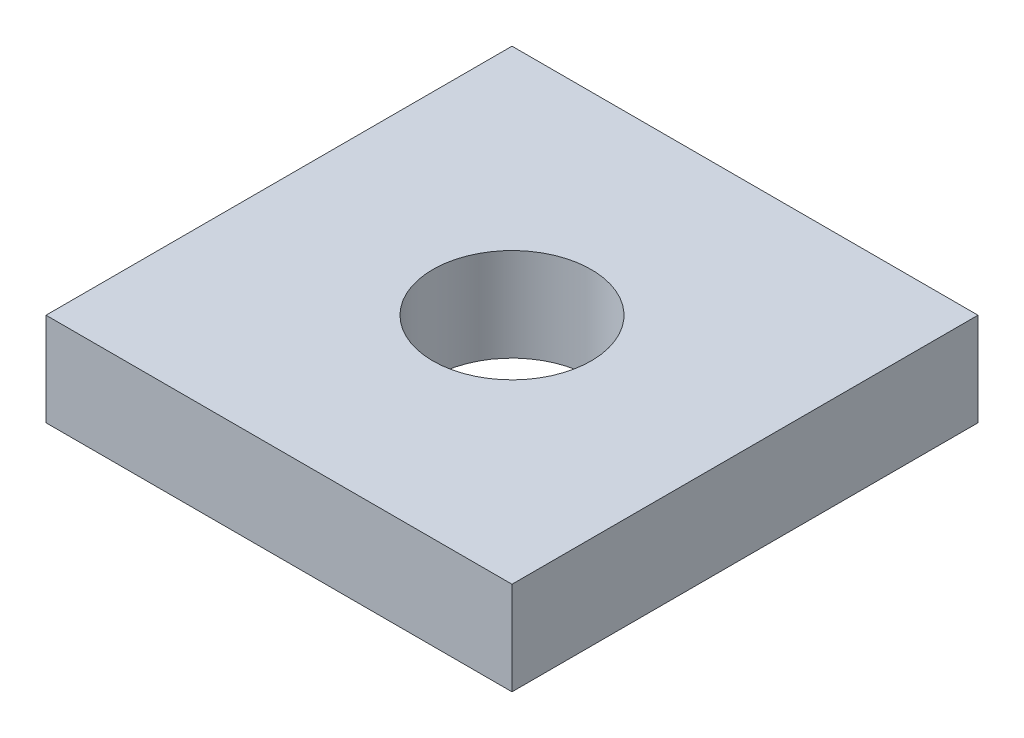
ISO-10303-21;
HEADER;
FILE_DESCRIPTION(('STEP AP214'),'2;1');
FILE_NAME('part.step','',(''),(''),'','','');
FILE_SCHEMA(('AUTOMOTIVE_DESIGN { 1 0 10303 214 1 1 1 1 }'));
ENDSEC;
DATA;
#1=APPLICATION_CONTEXT('core data for automotive mechanical design processes');
#2=APPLICATION_PROTOCOL_DEFINITION('international standard','automotive_design',2000,#1);
#3=PRODUCT_CONTEXT('',#1,'mechanical');
#4=PRODUCT('Part','Part','',(#3));
#5=PRODUCT_RELATED_PRODUCT_CATEGORY('part','',(#4));
#6=PRODUCT_DEFINITION_FORMATION('','',#4);
#7=PRODUCT_DEFINITION_CONTEXT('part definition',#1,'design');
#8=PRODUCT_DEFINITION('design','',#6,#7);
#9=PRODUCT_DEFINITION_SHAPE('','',#8);
#10=(LENGTH_UNIT() NAMED_UNIT(*) SI_UNIT(.MILLI.,.METRE.));
#11=(NAMED_UNIT(*) PLANE_ANGLE_UNIT() SI_UNIT($,.RADIAN.));
#12=(NAMED_UNIT(*) SI_UNIT($,.STERADIAN.) SOLID_ANGLE_UNIT());
#13=UNCERTAINTY_MEASURE_WITH_UNIT(LENGTH_MEASURE(1.E-05),#10,'distance_accuracy_value','');
#14=(GEOMETRIC_REPRESENTATION_CONTEXT(3) GLOBAL_UNCERTAINTY_ASSIGNED_CONTEXT((#13)) GLOBAL_UNIT_ASSIGNED_CONTEXT((#10,
#11,#12)) REPRESENTATION_CONTEXT('',''));
#15=CARTESIAN_POINT('',(0.,0.,0.));
#16=DIRECTION('',(0.,0.,1.));
#17=DIRECTION('',(1.,0.,0.));
#18=AXIS2_PLACEMENT_3D('',#15,#16,#17);
#19=CARTESIAN_POINT('',(10.,-2.,10.));
#20=DIRECTION('',(-1.,0.,0.));
#21=DIRECTION('',(0.,0.,1.));
#22=AXIS2_PLACEMENT_3D('',#19,#20,#21);
#23=PLANE('',#22);
#24=DIRECTION('',(0.,1.,0.));
#25=VECTOR('',#24,1.);
#26=CARTESIAN_POINT('',(10.,-2.,-10.));
#27=LINE('',#26,#25);
#28=CARTESIAN_POINT('',(10.,-2.,-10.));
#29=VERTEX_POINT('',#28);
#30=CARTESIAN_POINT('',(10.,2.,-10.));
#31=VERTEX_POINT('',#30);
#32=EDGE_CURVE('E100',#29,#31,#27,.T.);
#33=ORIENTED_EDGE('',*,*,#32,.T.);
#34=DIRECTION('',(0.,0.,-1.));
#35=VECTOR('',#34,1.);
#36=CARTESIAN_POINT('',(10.,2.,10.));
#37=LINE('',#36,#35);
#38=CARTESIAN_POINT('',(10.,2.,10.));
#39=VERTEX_POINT('',#38);
#40=EDGE_CURVE('E11',#39,#31,#37,.T.);
#41=ORIENTED_EDGE('',*,*,#40,.F.);
#42=DIRECTION('',(0.,1.,0.));
#43=VECTOR('',#42,1.);
#44=CARTESIAN_POINT('',(10.,-2.,10.));
#45=LINE('',#44,#43);
#46=CARTESIAN_POINT('',(10.,-2.,10.));
#47=VERTEX_POINT('',#46);
#48=EDGE_CURVE('E88',#47,#39,#45,.T.);
#49=ORIENTED_EDGE('',*,*,#48,.F.);
#50=DIRECTION('',(0.,0.,-1.));
#51=VECTOR('',#50,1.);
#52=CARTESIAN_POINT('',(10.,-2.,10.));
#53=LINE('',#52,#51);
#54=EDGE_CURVE('E96',#47,#29,#53,.T.);
#55=ORIENTED_EDGE('',*,*,#54,.T.);
#56=EDGE_LOOP('',(#33,#41,#49,#55));
#57=FACE_BOUND('',#56,.T.);
#58=ADVANCED_FACE('F37',(#57),#23,.F.);
#59=CARTESIAN_POINT('',(-10.,2.,10.));
#60=DIRECTION('',(0.,-1.,0.));
#61=DIRECTION('',(0.,0.,-1.));
#62=AXIS2_PLACEMENT_3D('',#59,#60,#61);
#63=PLANE('',#62);
#64=CARTESIAN_POINT('',(0.,2.,0.));
#65=DIRECTION('',(0.,1.,0.));
#66=DIRECTION('',(0.,0.,1.));
#67=AXIS2_PLACEMENT_3D('',#64,#65,#66);
#68=CIRCLE('',#67,3.39999999999999);
#69=CARTESIAN_POINT('',(0.,2.,3.39999999999999));
#70=VERTEX_POINT('',#69);
#71=EDGE_CURVE('E116',#70,#70,#68,.T.);
#72=ORIENTED_EDGE('',*,*,#71,.F.);
#73=EDGE_LOOP('',(#72));
#74=FACE_BOUND('',#73,.T.);
#75=DIRECTION('',(-1.,0.,0.));
#76=VECTOR('',#75,1.);
#77=CARTESIAN_POINT('',(-10.,2.,-10.));
#78=LINE('',#77,#76);
#79=CARTESIAN_POINT('',(-10.,2.,-10.));
#80=VERTEX_POINT('',#79);
#81=EDGE_CURVE('E92',#31,#80,#78,.T.);
#82=ORIENTED_EDGE('',*,*,#81,.T.);
#83=DIRECTION('',(0.,0.,-1.));
#84=VECTOR('',#83,1.);
#85=CARTESIAN_POINT('',(-10.,2.,10.));
#86=LINE('',#85,#84);
#87=CARTESIAN_POINT('',(-10.,2.,10.));
#88=VERTEX_POINT('',#87);
#89=EDGE_CURVE('E45',#88,#80,#86,.T.);
#90=ORIENTED_EDGE('',*,*,#89,.F.);
#91=DIRECTION('',(-1.,0.,0.));
#92=VECTOR('',#91,1.);
#93=CARTESIAN_POINT('',(-10.,2.,10.));
#94=LINE('',#93,#92);
#95=EDGE_CURVE('E83',#39,#88,#94,.T.);
#96=ORIENTED_EDGE('',*,*,#95,.F.);
#97=ORIENTED_EDGE('',*,*,#40,.T.);
#98=EDGE_LOOP('',(#82,#90,#96,#97));
#99=FACE_BOUND('',#98,.T.);
#100=ADVANCED_FACE('F91',(#74,#99),#63,.F.);
#101=CARTESIAN_POINT('',(-10.,-2.,10.));
#102=DIRECTION('',(1.,0.,0.));
#103=DIRECTION('',(0.,0.,-1.));
#104=AXIS2_PLACEMENT_3D('',#101,#102,#103);
#105=PLANE('',#104);
#106=DIRECTION('',(0.,-1.,0.));
#107=VECTOR('',#106,1.);
#108=CARTESIAN_POINT('',(-10.,-2.,-10.));
#109=LINE('',#108,#107);
#110=CARTESIAN_POINT('',(-10.,-2.,-10.));
#111=VERTEX_POINT('',#110);
#112=EDGE_CURVE('E70',#80,#111,#109,.T.);
#113=ORIENTED_EDGE('',*,*,#112,.T.);
#114=DIRECTION('',(0.,0.,-1.));
#115=VECTOR('',#114,1.);
#116=CARTESIAN_POINT('',(-10.,-2.,10.));
#117=LINE('',#116,#115);
#118=CARTESIAN_POINT('',(-10.,-2.,10.));
#119=VERTEX_POINT('',#118);
#120=EDGE_CURVE('E93',#119,#111,#117,.T.);
#121=ORIENTED_EDGE('',*,*,#120,.F.);
#122=DIRECTION('',(0.,-1.,0.));
#123=VECTOR('',#122,1.);
#124=CARTESIAN_POINT('',(-10.,-2.,10.));
#125=LINE('',#124,#123);
#126=EDGE_CURVE('E86',#88,#119,#125,.T.);
#127=ORIENTED_EDGE('',*,*,#126,.F.);
#128=ORIENTED_EDGE('',*,*,#89,.T.);
#129=EDGE_LOOP('',(#113,#121,#127,#128));
#130=FACE_BOUND('',#129,.T.);
#131=ADVANCED_FACE('F94',(#130),#105,.F.);
#132=CARTESIAN_POINT('',(-10.,-2.,10.));
#133=DIRECTION('',(0.,1.,0.));
#134=DIRECTION('',(0.,0.,1.));
#135=AXIS2_PLACEMENT_3D('',#132,#133,#134);
#136=PLANE('',#135);
#137=CARTESIAN_POINT('',(0.,-2.,0.));
#138=DIRECTION('',(0.,1.,0.));
#139=DIRECTION('',(0.,0.,1.));
#140=AXIS2_PLACEMENT_3D('',#137,#138,#139);
#141=CIRCLE('',#140,3.39999999999999);
#142=CARTESIAN_POINT('',(0.,-2.,3.39999999999999));
#143=VERTEX_POINT('',#142);
#144=EDGE_CURVE('E103',#143,#143,#141,.T.);
#145=ORIENTED_EDGE('',*,*,#144,.T.);
#146=EDGE_LOOP('',(#145));
#147=FACE_BOUND('',#146,.T.);
#148=DIRECTION('',(1.,0.,0.));
#149=VECTOR('',#148,1.);
#150=CARTESIAN_POINT('',(-10.,-2.,-10.));
#151=LINE('',#150,#149);
#152=EDGE_CURVE('E76',#111,#29,#151,.T.);
#153=ORIENTED_EDGE('',*,*,#152,.T.);
#154=ORIENTED_EDGE('',*,*,#54,.F.);
#155=DIRECTION('',(1.,0.,0.));
#156=VECTOR('',#155,1.);
#157=CARTESIAN_POINT('',(-10.,-2.,10.));
#158=LINE('',#157,#156);
#159=EDGE_CURVE('E53',#119,#47,#158,.T.);
#160=ORIENTED_EDGE('',*,*,#159,.F.);
#161=ORIENTED_EDGE('',*,*,#120,.T.);
#162=EDGE_LOOP('',(#153,#154,#160,#161));
#163=FACE_BOUND('',#162,.T.);
#164=ADVANCED_FACE('F108',(#147,#163),#136,.F.);
#165=CARTESIAN_POINT('',(0.,0.,10.));
#166=DIRECTION('',(0.,0.,-1.));
#167=DIRECTION('',(-1.,0.,0.));
#168=AXIS2_PLACEMENT_3D('',#165,#166,#167);
#169=PLANE('',#168);
#170=ORIENTED_EDGE('',*,*,#48,.T.);
#171=ORIENTED_EDGE('',*,*,#95,.T.);
#172=ORIENTED_EDGE('',*,*,#126,.T.);
#173=ORIENTED_EDGE('',*,*,#159,.T.);
#174=EDGE_LOOP('',(#170,#171,#172,#173));
#175=FACE_BOUND('',#174,.T.);
#176=ADVANCED_FACE('F84',(#175),#169,.F.);
#177=CARTESIAN_POINT('',(0.,0.,-10.));
#178=DIRECTION('',(0.,0.,-1.));
#179=DIRECTION('',(-1.,0.,0.));
#180=AXIS2_PLACEMENT_3D('',#177,#178,#179);
#181=PLANE('',#180);
#182=ORIENTED_EDGE('',*,*,#32,.F.);
#183=ORIENTED_EDGE('',*,*,#152,.F.);
#184=ORIENTED_EDGE('',*,*,#112,.F.);
#185=ORIENTED_EDGE('',*,*,#81,.F.);
#186=EDGE_LOOP('',(#182,#183,#184,#185));
#187=FACE_BOUND('',#186,.T.);
#188=ADVANCED_FACE('F111',(#187),#181,.T.);
#189=CARTESIAN_POINT('',(0.,2.,0.));
#190=DIRECTION('',(0.,1.,0.));
#191=DIRECTION('',(0.,0.,1.));
#192=AXIS2_PLACEMENT_3D('',#189,#190,#191);
#193=CYLINDRICAL_SURFACE('',#192,3.39999999999999);
#194=ORIENTED_EDGE('',*,*,#144,.F.);
#195=EDGE_LOOP('',(#194));
#196=FACE_BOUND('',#195,.T.);
#197=ORIENTED_EDGE('',*,*,#71,.T.);
#198=EDGE_LOOP('',(#197));
#199=FACE_BOUND('',#198,.T.);
#200=ADVANCED_FACE('F120',(#196,#199),#193,.F.);
#201=CLOSED_SHELL('',(#58,#100,#131,#164,#176,#188,#200));
#202=MANIFOLD_SOLID_BREP('B2',#201);
#203=ADVANCED_BREP_SHAPE_REPRESENTATION('',(#18,#202),#14);
#204=SHAPE_DEFINITION_REPRESENTATION(#9,#203);
ENDSEC;
END-ISO-10303-21;
